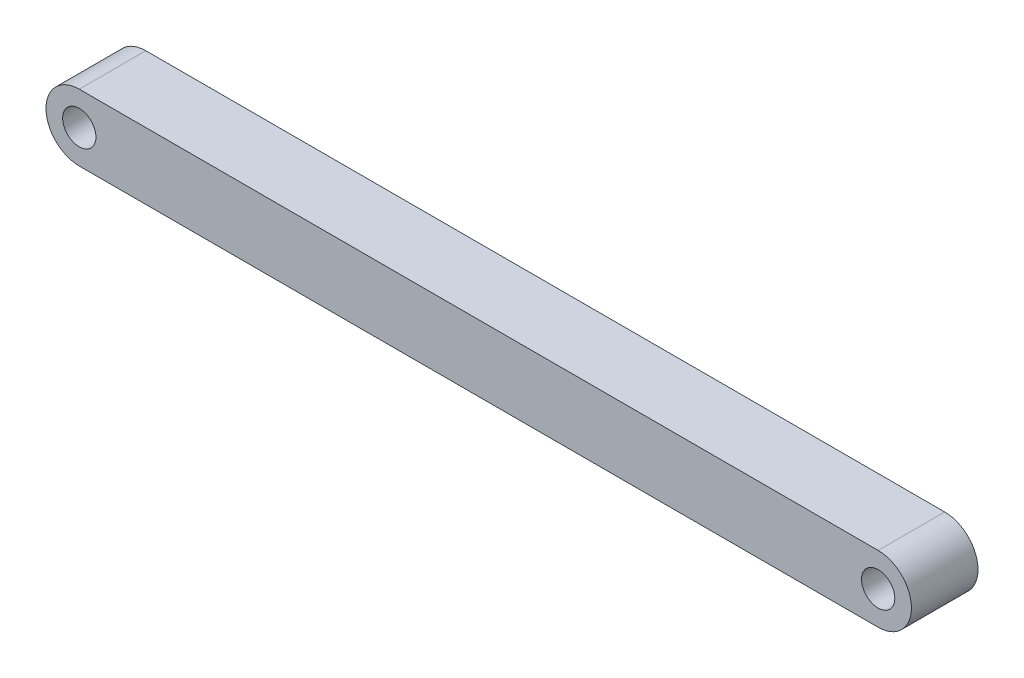
ISO-10303-21;
HEADER;
FILE_DESCRIPTION(('STEP AP214'),'2;1');
FILE_NAME('part.step','',(''),(''),'','','');
FILE_SCHEMA(('AUTOMOTIVE_DESIGN { 1 0 10303 214 1 1 1 1 }'));
ENDSEC;
DATA;
#1=APPLICATION_CONTEXT('core data for automotive mechanical design processes');
#2=APPLICATION_PROTOCOL_DEFINITION('international standard','automotive_design',2000,#1);
#3=PRODUCT_CONTEXT('',#1,'mechanical');
#4=PRODUCT('Part','Part','',(#3));
#5=PRODUCT_RELATED_PRODUCT_CATEGORY('part','',(#4));
#6=PRODUCT_DEFINITION_FORMATION('','',#4);
#7=PRODUCT_DEFINITION_CONTEXT('part definition',#1,'design');
#8=PRODUCT_DEFINITION('design','',#6,#7);
#9=PRODUCT_DEFINITION_SHAPE('','',#8);
#10=(LENGTH_UNIT() NAMED_UNIT(*) SI_UNIT(.MILLI.,.METRE.));
#11=(NAMED_UNIT(*) PLANE_ANGLE_UNIT() SI_UNIT($,.RADIAN.));
#12=(NAMED_UNIT(*) SI_UNIT($,.STERADIAN.) SOLID_ANGLE_UNIT());
#13=UNCERTAINTY_MEASURE_WITH_UNIT(LENGTH_MEASURE(1.E-05),#10,'distance_accuracy_value','');
#14=(GEOMETRIC_REPRESENTATION_CONTEXT(3) GLOBAL_UNCERTAINTY_ASSIGNED_CONTEXT((#13)) GLOBAL_UNIT_ASSIGNED_CONTEXT((#10,
#11,#12)) REPRESENTATION_CONTEXT('',''));
#15=CARTESIAN_POINT('',(0.,0.,0.));
#16=DIRECTION('',(0.,0.,1.));
#17=DIRECTION('',(1.,0.,0.));
#18=AXIS2_PLACEMENT_3D('',#15,#16,#17);
#19=CARTESIAN_POINT('',(108.277164679753,65.4293406084366,31.));
#20=DIRECTION('',(0.,0.,1.));
#21=DIRECTION('',(1.,0.,0.));
#22=AXIS2_PLACEMENT_3D('',#19,#20,#21);
#23=PLANE('',#22);
#24=CARTESIAN_POINT('',(108.277164679753,65.4293406084366,31.));
#25=DIRECTION('',(0.,0.,1.));
#26=DIRECTION('',(1.,0.,0.));
#27=AXIS2_PLACEMENT_3D('',#24,#25,#26);
#28=CIRCLE('',#27,2.5);
#29=CARTESIAN_POINT('',(110.777164679753,65.4293406084366,31.));
#30=VERTEX_POINT('',#29);
#31=EDGE_CURVE('E97',#30,#30,#28,.T.);
#32=ORIENTED_EDGE('',*,*,#31,.F.);
#33=EDGE_LOOP('',(#32));
#34=FACE_BOUND('',#33,.T.);
#35=CARTESIAN_POINT('',(108.277164679753,65.4293406084366,31.));
#36=DIRECTION('',(0.,0.,1.));
#37=DIRECTION('',(1.,0.,0.));
#38=AXIS2_PLACEMENT_3D('',#35,#36,#37);
#39=CIRCLE('',#38,5.00000000000002);
#40=CARTESIAN_POINT('',(108.277164679753,70.4293406084367,31.));
#41=VERTEX_POINT('',#40);
#42=CARTESIAN_POINT('',(108.277164679753,60.4293406084366,31.));
#43=VERTEX_POINT('',#42);
#44=EDGE_CURVE('E82',#41,#43,#39,.T.);
#45=ORIENTED_EDGE('',*,*,#44,.T.);
#46=DIRECTION('',(1.,0.,0.));
#47=VECTOR('',#46,1.);
#48=CARTESIAN_POINT('',(108.277164679753,60.4293406084366,31.));
#49=LINE('',#48,#47);
#50=CARTESIAN_POINT('',(228.277164679753,60.4293406084366,31.));
#51=VERTEX_POINT('',#50);
#52=EDGE_CURVE('E77',#43,#51,#49,.T.);
#53=ORIENTED_EDGE('',*,*,#52,.T.);
#54=CARTESIAN_POINT('',(228.277164679753,65.4293406084366,31.));
#55=DIRECTION('',(0.,0.,1.));
#56=DIRECTION('',(1.,0.,0.));
#57=AXIS2_PLACEMENT_3D('',#54,#55,#56);
#58=CIRCLE('',#57,5.00000000000002);
#59=CARTESIAN_POINT('',(228.277164679753,70.4293406084367,31.));
#60=VERTEX_POINT('',#59);
#61=EDGE_CURVE('E80',#51,#60,#58,.T.);
#62=ORIENTED_EDGE('',*,*,#61,.T.);
#63=DIRECTION('',(-1.,0.,0.));
#64=VECTOR('',#63,1.);
#65=CARTESIAN_POINT('',(108.277164679753,70.4293406084367,31.));
#66=LINE('',#65,#64);
#67=EDGE_CURVE('E47',#60,#41,#66,.T.);
#68=ORIENTED_EDGE('',*,*,#67,.T.);
#69=EDGE_LOOP('',(#45,#53,#62,#68));
#70=FACE_BOUND('',#69,.T.);
#71=CARTESIAN_POINT('',(228.277164679753,65.4293406084366,31.));
#72=DIRECTION('',(0.,0.,1.));
#73=DIRECTION('',(1.,0.,0.));
#74=AXIS2_PLACEMENT_3D('',#71,#72,#73);
#75=CIRCLE('',#74,2.5);
#76=CARTESIAN_POINT('',(230.777164679753,65.4293406084366,31.));
#77=VERTEX_POINT('',#76);
#78=EDGE_CURVE('E112',#77,#77,#75,.T.);
#79=ORIENTED_EDGE('',*,*,#78,.F.);
#80=EDGE_LOOP('',(#79));
#81=FACE_BOUND('',#80,.T.);
#82=ADVANCED_FACE('F30',(#34,#70,#81),#23,.T.);
#83=CARTESIAN_POINT('',(108.277164679753,65.4293406084366,21.));
#84=DIRECTION('',(0.,0.,1.));
#85=DIRECTION('',(1.,0.,0.));
#86=AXIS2_PLACEMENT_3D('',#83,#84,#85);
#87=PLANE('',#86);
#88=CARTESIAN_POINT('',(108.277164679753,65.4293406084366,21.));
#89=DIRECTION('',(0.,0.,1.));
#90=DIRECTION('',(1.,0.,0.));
#91=AXIS2_PLACEMENT_3D('',#88,#89,#90);
#92=CIRCLE('',#91,5.00000000000002);
#93=CARTESIAN_POINT('',(108.277164679753,70.4293406084367,21.));
#94=VERTEX_POINT('',#93);
#95=CARTESIAN_POINT('',(108.277164679753,60.4293406084366,21.));
#96=VERTEX_POINT('',#95);
#97=EDGE_CURVE('E94',#94,#96,#92,.T.);
#98=ORIENTED_EDGE('',*,*,#97,.F.);
#99=DIRECTION('',(-1.,0.,0.));
#100=VECTOR('',#99,1.);
#101=CARTESIAN_POINT('',(108.277164679753,70.4293406084367,21.));
#102=LINE('',#101,#100);
#103=CARTESIAN_POINT('',(228.277164679753,70.4293406084367,21.));
#104=VERTEX_POINT('',#103);
#105=EDGE_CURVE('E70',#104,#94,#102,.T.);
#106=ORIENTED_EDGE('',*,*,#105,.F.);
#107=CARTESIAN_POINT('',(228.277164679753,65.4293406084366,21.));
#108=DIRECTION('',(0.,0.,1.));
#109=DIRECTION('',(1.,0.,0.));
#110=AXIS2_PLACEMENT_3D('',#107,#108,#109);
#111=CIRCLE('',#110,5.00000000000002);
#112=CARTESIAN_POINT('',(228.277164679753,60.4293406084366,21.));
#113=VERTEX_POINT('',#112);
#114=EDGE_CURVE('E64',#113,#104,#111,.T.);
#115=ORIENTED_EDGE('',*,*,#114,.F.);
#116=DIRECTION('',(1.,0.,0.));
#117=VECTOR('',#116,1.);
#118=CARTESIAN_POINT('',(108.277164679753,60.4293406084366,21.));
#119=LINE('',#118,#117);
#120=EDGE_CURVE('E86',#96,#113,#119,.T.);
#121=ORIENTED_EDGE('',*,*,#120,.F.);
#122=EDGE_LOOP('',(#98,#106,#115,#121));
#123=FACE_BOUND('',#122,.T.);
#124=CARTESIAN_POINT('',(108.277164679753,65.4293406084366,21.));
#125=DIRECTION('',(0.,0.,1.));
#126=DIRECTION('',(1.,0.,0.));
#127=AXIS2_PLACEMENT_3D('',#124,#125,#126);
#128=CIRCLE('',#127,2.5);
#129=CARTESIAN_POINT('',(110.777164679753,65.4293406084366,21.));
#130=VERTEX_POINT('',#129);
#131=EDGE_CURVE('E109',#130,#130,#128,.T.);
#132=ORIENTED_EDGE('',*,*,#131,.T.);
#133=EDGE_LOOP('',(#132));
#134=FACE_BOUND('',#133,.T.);
#135=CARTESIAN_POINT('',(228.277164679753,65.4293406084366,21.));
#136=DIRECTION('',(0.,0.,1.));
#137=DIRECTION('',(1.,0.,0.));
#138=AXIS2_PLACEMENT_3D('',#135,#136,#137);
#139=CIRCLE('',#138,2.5);
#140=CARTESIAN_POINT('',(230.777164679753,65.4293406084366,21.));
#141=VERTEX_POINT('',#140);
#142=EDGE_CURVE('E115',#141,#141,#139,.T.);
#143=ORIENTED_EDGE('',*,*,#142,.T.);
#144=EDGE_LOOP('',(#143));
#145=FACE_BOUND('',#144,.T.);
#146=ADVANCED_FACE('F105',(#123,#134,#145),#87,.F.);
#147=CARTESIAN_POINT('',(108.277164679753,65.4293406084366,31.));
#148=DIRECTION('',(0.,0.,-1.));
#149=DIRECTION('',(-1.,0.,0.));
#150=AXIS2_PLACEMENT_3D('',#147,#148,#149);
#151=CYLINDRICAL_SURFACE('',#150,5.00000000000002);
#152=ORIENTED_EDGE('',*,*,#97,.T.);
#153=DIRECTION('',(0.,0.,-1.));
#154=VECTOR('',#153,1.);
#155=CARTESIAN_POINT('',(108.277164679753,60.4293406084366,31.));
#156=LINE('',#155,#154);
#157=EDGE_CURVE('E11',#43,#96,#156,.T.);
#158=ORIENTED_EDGE('',*,*,#157,.F.);
#159=ORIENTED_EDGE('',*,*,#44,.F.);
#160=DIRECTION('',(0.,0.,-1.));
#161=VECTOR('',#160,1.);
#162=CARTESIAN_POINT('',(108.277164679753,70.4293406084367,31.));
#163=LINE('',#162,#161);
#164=EDGE_CURVE('E90',#41,#94,#163,.T.);
#165=ORIENTED_EDGE('',*,*,#164,.T.);
#166=EDGE_LOOP('',(#152,#158,#159,#165));
#167=FACE_BOUND('',#166,.T.);
#168=ADVANCED_FACE('F32',(#167),#151,.T.);
#169=CARTESIAN_POINT('',(108.277164679753,60.4293406084366,31.));
#170=DIRECTION('',(0.,1.,0.));
#171=DIRECTION('',(0.,0.,1.));
#172=AXIS2_PLACEMENT_3D('',#169,#170,#171);
#173=PLANE('',#172);
#174=ORIENTED_EDGE('',*,*,#120,.T.);
#175=DIRECTION('',(0.,0.,-1.));
#176=VECTOR('',#175,1.);
#177=CARTESIAN_POINT('',(228.277164679753,60.4293406084366,31.));
#178=LINE('',#177,#176);
#179=EDGE_CURVE('E39',#51,#113,#178,.T.);
#180=ORIENTED_EDGE('',*,*,#179,.F.);
#181=ORIENTED_EDGE('',*,*,#52,.F.);
#182=ORIENTED_EDGE('',*,*,#157,.T.);
#183=EDGE_LOOP('',(#174,#180,#181,#182));
#184=FACE_BOUND('',#183,.T.);
#185=ADVANCED_FACE('F85',(#184),#173,.F.);
#186=CARTESIAN_POINT('',(228.277164679753,65.4293406084366,31.));
#187=DIRECTION('',(0.,0.,-1.));
#188=DIRECTION('',(-1.,0.,0.));
#189=AXIS2_PLACEMENT_3D('',#186,#187,#188);
#190=CYLINDRICAL_SURFACE('',#189,5.00000000000002);
#191=ORIENTED_EDGE('',*,*,#114,.T.);
#192=DIRECTION('',(0.,0.,-1.));
#193=VECTOR('',#192,1.);
#194=CARTESIAN_POINT('',(228.277164679753,70.4293406084367,31.));
#195=LINE('',#194,#193);
#196=EDGE_CURVE('E87',#60,#104,#195,.T.);
#197=ORIENTED_EDGE('',*,*,#196,.F.);
#198=ORIENTED_EDGE('',*,*,#61,.F.);
#199=ORIENTED_EDGE('',*,*,#179,.T.);
#200=EDGE_LOOP('',(#191,#197,#198,#199));
#201=FACE_BOUND('',#200,.T.);
#202=ADVANCED_FACE('F88',(#201),#190,.T.);
#203=CARTESIAN_POINT('',(108.277164679753,70.4293406084367,31.));
#204=DIRECTION('',(0.,-1.,0.));
#205=DIRECTION('',(0.,0.,-1.));
#206=AXIS2_PLACEMENT_3D('',#203,#204,#205);
#207=PLANE('',#206);
#208=ORIENTED_EDGE('',*,*,#105,.T.);
#209=ORIENTED_EDGE('',*,*,#164,.F.);
#210=ORIENTED_EDGE('',*,*,#67,.F.);
#211=ORIENTED_EDGE('',*,*,#196,.T.);
#212=EDGE_LOOP('',(#208,#209,#210,#211));
#213=FACE_BOUND('',#212,.T.);
#214=ADVANCED_FACE('F102',(#213),#207,.F.);
#215=CARTESIAN_POINT('',(108.277164679753,65.4293406084366,31.));
#216=DIRECTION('',(0.,0.,-1.));
#217=DIRECTION('',(-1.,0.,0.));
#218=AXIS2_PLACEMENT_3D('',#215,#216,#217);
#219=CYLINDRICAL_SURFACE('',#218,2.5);
#220=ORIENTED_EDGE('',*,*,#31,.T.);
#221=EDGE_LOOP('',(#220));
#222=FACE_BOUND('',#221,.T.);
#223=ORIENTED_EDGE('',*,*,#131,.F.);
#224=EDGE_LOOP('',(#223));
#225=FACE_BOUND('',#224,.T.);
#226=ADVANCED_FACE('F132',(#222,#225),#219,.F.);
#227=CARTESIAN_POINT('',(228.277164679753,65.4293406084366,31.));
#228=DIRECTION('',(0.,0.,-1.));
#229=DIRECTION('',(-1.,0.,0.));
#230=AXIS2_PLACEMENT_3D('',#227,#228,#229);
#231=CYLINDRICAL_SURFACE('',#230,2.5);
#232=ORIENTED_EDGE('',*,*,#78,.T.);
#233=EDGE_LOOP('',(#232));
#234=FACE_BOUND('',#233,.T.);
#235=ORIENTED_EDGE('',*,*,#142,.F.);
#236=EDGE_LOOP('',(#235));
#237=FACE_BOUND('',#236,.T.);
#238=ADVANCED_FACE('F121',(#234,#237),#231,.F.);
#239=CLOSED_SHELL('',(#82,#146,#168,#185,#202,#214,#226,#238));
#240=MANIFOLD_SOLID_BREP('B2',#239);
#241=ADVANCED_BREP_SHAPE_REPRESENTATION('',(#18,#240),#14);
#242=SHAPE_DEFINITION_REPRESENTATION(#9,#241);
ENDSEC;
END-ISO-10303-21;
